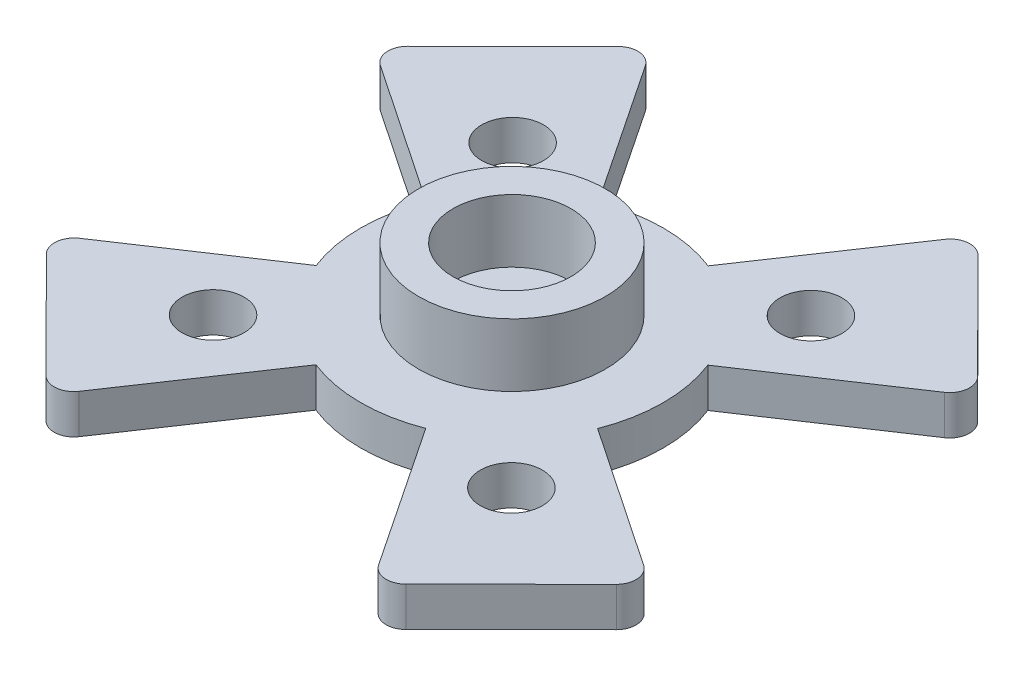
ISO-10303-21;
HEADER;
FILE_DESCRIPTION(('STEP AP214'),'2;1');
FILE_NAME('part.step','',(''),(''),'','','');
FILE_SCHEMA(('AUTOMOTIVE_DESIGN { 1 0 10303 214 1 1 1 1 }'));
ENDSEC;
DATA;
#1=APPLICATION_CONTEXT('core data for automotive mechanical design processes');
#2=APPLICATION_PROTOCOL_DEFINITION('international standard','automotive_design',2000,#1);
#3=PRODUCT_CONTEXT('',#1,'mechanical');
#4=PRODUCT('Part','Part','',(#3));
#5=PRODUCT_RELATED_PRODUCT_CATEGORY('part','',(#4));
#6=PRODUCT_DEFINITION_FORMATION('','',#4);
#7=PRODUCT_DEFINITION_CONTEXT('part definition',#1,'design');
#8=PRODUCT_DEFINITION('design','',#6,#7);
#9=PRODUCT_DEFINITION_SHAPE('','',#8);
#10=(LENGTH_UNIT() NAMED_UNIT(*) SI_UNIT(.MILLI.,.METRE.));
#11=(NAMED_UNIT(*) PLANE_ANGLE_UNIT() SI_UNIT($,.RADIAN.));
#12=(NAMED_UNIT(*) SI_UNIT($,.STERADIAN.) SOLID_ANGLE_UNIT());
#13=UNCERTAINTY_MEASURE_WITH_UNIT(LENGTH_MEASURE(1.E-05),#10,'distance_accuracy_value','');
#14=(GEOMETRIC_REPRESENTATION_CONTEXT(3) GLOBAL_UNCERTAINTY_ASSIGNED_CONTEXT((#13)) GLOBAL_UNIT_ASSIGNED_CONTEXT((#10,
#11,#12)) REPRESENTATION_CONTEXT('',''));
#15=CARTESIAN_POINT('',(0.,0.,0.));
#16=DIRECTION('',(0.,0.,1.));
#17=DIRECTION('',(1.,0.,0.));
#18=AXIS2_PLACEMENT_3D('',#15,#16,#17);
#19=CARTESIAN_POINT('',(0.,2.,0.));
#20=DIRECTION('',(0.,-1.,0.));
#21=DIRECTION('',(0.,0.,-1.));
#22=AXIS2_PLACEMENT_3D('',#19,#20,#21);
#23=CYLINDRICAL_SURFACE('',#22,7.69439913854554);
#24=CARTESIAN_POINT('',(0.,0.,0.));
#25=DIRECTION('',(0.,1.,0.));
#26=DIRECTION('',(0.,0.,1.));
#27=AXIS2_PLACEMENT_3D('',#24,#25,#26);
#28=CIRCLE('',#27,7.69439913854554);
#29=CARTESIAN_POINT('',(-2.80873592660673,0.,7.16343357600523));
#30=VERTEX_POINT('',#29);
#31=CARTESIAN_POINT('',(2.78582338133103,0.,7.17237521266699));
#32=VERTEX_POINT('',#31);
#33=EDGE_CURVE('E280',#30,#32,#28,.T.);
#34=ORIENTED_EDGE('',*,*,#33,.T.);
#35=DIRECTION('',(0.,-1.,0.));
#36=VECTOR('',#35,1.);
#37=CARTESIAN_POINT('',(2.78582338133103,2.,7.17237521266699));
#38=LINE('',#37,#36);
#39=CARTESIAN_POINT('',(2.78582338133103,2.,7.17237521266699));
#40=VERTEX_POINT('',#39);
#41=EDGE_CURVE('E261',#40,#32,#38,.T.);
#42=ORIENTED_EDGE('',*,*,#41,.F.);
#43=CARTESIAN_POINT('',(0.,2.,0.));
#44=DIRECTION('',(0.,1.,0.));
#45=DIRECTION('',(0.,0.,1.));
#46=AXIS2_PLACEMENT_3D('',#43,#44,#45);
#47=CIRCLE('',#46,7.69439913854554);
#48=CARTESIAN_POINT('',(-2.80873592660673,2.,7.16343357600523));
#49=VERTEX_POINT('',#48);
#50=EDGE_CURVE('E268',#49,#40,#47,.T.);
#51=ORIENTED_EDGE('',*,*,#50,.F.);
#52=DIRECTION('',(0.,-1.,0.));
#53=VECTOR('',#52,1.);
#54=CARTESIAN_POINT('',(-2.80873592660673,2.,7.16343357600523));
#55=LINE('',#54,#53);
#56=EDGE_CURVE('E441',#49,#30,#55,.T.);
#57=ORIENTED_EDGE('',*,*,#56,.T.);
#58=EDGE_LOOP('',(#34,#42,#51,#57));
#59=FACE_BOUND('',#58,.T.);
#60=ADVANCED_FACE('F92',(#59),#23,.T.);
#61=CARTESIAN_POINT('',(-1.38542538001352,2.,0.925024768868775));
#62=DIRECTION('',(-0.831660032932372,0.,0.555285142627574));
#63=DIRECTION('',(0.555285142627574,0.,0.831660032932373));
#64=AXIS2_PLACEMENT_3D('',#61,#62,#63);
#65=PLANE('',#64);
#66=DIRECTION('',(-0.555285142627574,0.,-0.831660032932373));
#67=VECTOR('',#66,1.);
#68=CARTESIAN_POINT('',(-1.38542538001352,0.,0.925024768868775));
#69=LINE('',#68,#67);
#70=CARTESIAN_POINT('',(7.60180761130886,0.,14.3853569689454));
#71=VERTEX_POINT('',#70);
#72=EDGE_CURVE('E613',#71,#32,#69,.T.);
#73=ORIENTED_EDGE('',*,*,#72,.F.);
#74=DIRECTION('',(0.,-1.,0.));
#75=VECTOR('',#74,1.);
#76=CARTESIAN_POINT('',(7.60180761130886,2.,14.3853569689454));
#77=LINE('',#76,#75);
#78=CARTESIAN_POINT('',(7.60180761130886,2.,14.3853569689454));
#79=VERTEX_POINT('',#78);
#80=EDGE_CURVE('E264',#71,#79,#77,.F.);
#81=ORIENTED_EDGE('',*,*,#80,.T.);
#82=DIRECTION('',(-0.555285142627574,0.,-0.831660032932373));
#83=VECTOR('',#82,1.);
#84=CARTESIAN_POINT('',(-1.38542538001352,2.,0.925024768868775));
#85=LINE('',#84,#83);
#86=EDGE_CURVE('E256',#79,#40,#85,.T.);
#87=ORIENTED_EDGE('',*,*,#86,.T.);
#88=ORIENTED_EDGE('',*,*,#41,.T.);
#89=EDGE_LOOP('',(#73,#81,#87,#88));
#90=FACE_BOUND('',#89,.T.);
#91=ADVANCED_FACE('F259',(#90),#65,.T.);
#92=CARTESIAN_POINT('',(11.8212683903879,2.,11.8667648689992));
#93=DIRECTION('',(0.705747373113323,0.,0.708463580816716));
#94=DIRECTION('',(0.708463580816716,0.,-0.705747373113323));
#95=AXIS2_PLACEMENT_3D('',#92,#93,#94);
#96=PLANE('',#95);
#97=DIRECTION('',(-0.708463580816716,0.,0.705747373113323));
#98=VECTOR('',#97,1.);
#99=CARTESIAN_POINT('',(11.8212683903879,0.,11.8667648689992));
#100=LINE('',#99,#98);
#101=CARTESIAN_POINT('',(14.5009215876691,0.,9.19738530448324));
#102=VERTEX_POINT('',#101);
#103=CARTESIAN_POINT('',(9.13921501735455,0.,14.5385354071345));
#104=VERTEX_POINT('',#103);
#105=EDGE_CURVE('E483',#102,#104,#100,.T.);
#106=ORIENTED_EDGE('',*,*,#105,.F.);
#107=DIRECTION('',(0.,-1.,0.));
#108=VECTOR('',#107,1.);
#109=CARTESIAN_POINT('',(14.5009215876691,2.,9.19738530448324));
#110=LINE('',#109,#108);
#111=CARTESIAN_POINT('',(14.5009215876691,2.,9.19738530448324));
#112=VERTEX_POINT('',#111);
#113=EDGE_CURVE('E372',#102,#112,#110,.F.);
#114=ORIENTED_EDGE('',*,*,#113,.T.);
#115=DIRECTION('',(-0.708463580816716,0.,0.705747373113323));
#116=VECTOR('',#115,1.);
#117=CARTESIAN_POINT('',(11.8212683903879,2.,11.8667648689992));
#118=LINE('',#117,#116);
#119=CARTESIAN_POINT('',(9.13921501735455,2.,14.5385354071345));
#120=VERTEX_POINT('',#119);
#121=EDGE_CURVE('E267',#112,#120,#118,.T.);
#122=ORIENTED_EDGE('',*,*,#121,.T.);
#123=DIRECTION('',(0.,-1.,0.));
#124=VECTOR('',#123,1.);
#125=CARTESIAN_POINT('',(9.13921501735455,2.,14.5385354071345));
#126=LINE('',#125,#124);
#127=EDGE_CURVE('E368',#120,#104,#126,.T.);
#128=ORIENTED_EDGE('',*,*,#127,.T.);
#129=EDGE_LOOP('',(#106,#114,#122,#128));
#130=FACE_BOUND('',#129,.T.);
#131=ADVANCED_FACE('F621',(#130),#96,.T.);
#132=CARTESIAN_POINT('',(0.938303404335213,2.,-1.39086193938097));
#133=DIRECTION('',(0.559256471974237,0.,-0.828994691511911));
#134=DIRECTION('',(-0.828994691511911,0.,-0.559256471974237));
#135=AXIS2_PLACEMENT_3D('',#132,#133,#134);
#136=PLANE('',#135);
#137=DIRECTION('',(0.828994691511911,0.,0.559256471974237));
#138=VECTOR('',#137,1.);
#139=CARTESIAN_POINT('',(0.938303404335213,2.,-1.39086193938097));
#140=LINE('',#139,#138);
#141=CARTESIAN_POINT('',(7.16343357600523,2.,2.80873592660673));
#142=VERTEX_POINT('',#141);
#143=CARTESIAN_POINT('',(14.35443068653,2.,7.65992703215462));
#144=VERTEX_POINT('',#143);
#145=EDGE_CURVE('E571',#142,#144,#140,.T.);
#146=ORIENTED_EDGE('',*,*,#145,.T.);
#147=DIRECTION('',(0.,-1.,0.));
#148=VECTOR('',#147,1.);
#149=CARTESIAN_POINT('',(14.35443068653,2.,7.65992703215462));
#150=LINE('',#149,#148);
#151=CARTESIAN_POINT('',(14.35443068653,0.,7.65992703215462));
#152=VERTEX_POINT('',#151);
#153=EDGE_CURVE('E364',#144,#152,#150,.T.);
#154=ORIENTED_EDGE('',*,*,#153,.T.);
#155=DIRECTION('',(0.828994691511911,0.,0.559256471974237));
#156=VECTOR('',#155,1.);
#157=CARTESIAN_POINT('',(0.938303404335213,0.,-1.39086193938097));
#158=LINE('',#157,#156);
#159=CARTESIAN_POINT('',(7.16343357600523,0.,2.80873592660673));
#160=VERTEX_POINT('',#159);
#161=EDGE_CURVE('E477',#160,#152,#158,.T.);
#162=ORIENTED_EDGE('',*,*,#161,.F.);
#163=DIRECTION('',(0.,-1.,0.));
#164=VECTOR('',#163,1.);
#165=CARTESIAN_POINT('',(7.16343357600523,2.,2.80873592660673));
#166=LINE('',#165,#164);
#167=EDGE_CURVE('E283',#142,#160,#166,.T.);
#168=ORIENTED_EDGE('',*,*,#167,.F.);
#169=EDGE_LOOP('',(#146,#154,#162,#168));
#170=FACE_BOUND('',#169,.T.);
#171=ADVANCED_FACE('F631',(#170),#136,.T.);
#172=CARTESIAN_POINT('',(0.,2.,0.));
#173=DIRECTION('',(0.,-1.,0.));
#174=DIRECTION('',(0.,0.,-1.));
#175=AXIS2_PLACEMENT_3D('',#172,#173,#174);
#176=CYLINDRICAL_SURFACE('',#175,7.69439913854554);
#177=CARTESIAN_POINT('',(0.,0.,0.));
#178=DIRECTION('',(0.,1.,0.));
#179=DIRECTION('',(0.,0.,1.));
#180=AXIS2_PLACEMENT_3D('',#177,#178,#179);
#181=CIRCLE('',#180,7.69439913854554);
#182=CARTESIAN_POINT('',(7.17237521266698,0.,-2.78582338133103));
#183=VERTEX_POINT('',#182);
#184=EDGE_CURVE('E472',#160,#183,#181,.T.);
#185=ORIENTED_EDGE('',*,*,#184,.T.);
#186=DIRECTION('',(0.,-1.,0.));
#187=VECTOR('',#186,1.);
#188=CARTESIAN_POINT('',(7.17237521266698,2.,-2.78582338133103));
#189=LINE('',#188,#187);
#190=CARTESIAN_POINT('',(7.17237521266698,2.,-2.78582338133103));
#191=VERTEX_POINT('',#190);
#192=EDGE_CURVE('E290',#191,#183,#189,.T.);
#193=ORIENTED_EDGE('',*,*,#192,.F.);
#194=CARTESIAN_POINT('',(0.,2.,0.));
#195=DIRECTION('',(0.,1.,0.));
#196=DIRECTION('',(0.,0.,1.));
#197=AXIS2_PLACEMENT_3D('',#194,#195,#196);
#198=CIRCLE('',#197,7.69439913854554);
#199=EDGE_CURVE('E565',#142,#191,#198,.T.);
#200=ORIENTED_EDGE('',*,*,#199,.F.);
#201=ORIENTED_EDGE('',*,*,#167,.T.);
#202=EDGE_LOOP('',(#185,#193,#200,#201));
#203=FACE_BOUND('',#202,.T.);
#204=ADVANCED_FACE('F473',(#203),#176,.T.);
#205=CARTESIAN_POINT('',(0.925024768868775,2.,1.38542538001352));
#206=DIRECTION('',(0.555285142627574,0.,0.831660032932373));
#207=DIRECTION('',(0.831660032932373,0.,-0.555285142627574));
#208=AXIS2_PLACEMENT_3D('',#205,#206,#207);
#209=PLANE('',#208);
#210=DIRECTION('',(-0.831660032932373,0.,0.555285142627574));
#211=VECTOR('',#210,1.);
#212=CARTESIAN_POINT('',(0.925024768868775,0.,1.38542538001352));
#213=LINE('',#212,#211);
#214=CARTESIAN_POINT('',(14.3853569689454,0.,-7.60180761130886));
#215=VERTEX_POINT('',#214);
#216=EDGE_CURVE('E464',#215,#183,#213,.T.);
#217=ORIENTED_EDGE('',*,*,#216,.F.);
#218=DIRECTION('',(0.,-1.,0.));
#219=VECTOR('',#218,1.);
#220=CARTESIAN_POINT('',(14.3853569689454,2.,-7.60180761130886));
#221=LINE('',#220,#219);
#222=CARTESIAN_POINT('',(14.3853569689454,2.,-7.60180761130886));
#223=VERTEX_POINT('',#222);
#224=EDGE_CURVE('E375',#215,#223,#221,.F.);
#225=ORIENTED_EDGE('',*,*,#224,.T.);
#226=DIRECTION('',(-0.831660032932373,0.,0.555285142627574));
#227=VECTOR('',#226,1.);
#228=CARTESIAN_POINT('',(0.925024768868775,2.,1.38542538001352));
#229=LINE('',#228,#227);
#230=EDGE_CURVE('E467',#223,#191,#229,.T.);
#231=ORIENTED_EDGE('',*,*,#230,.T.);
#232=ORIENTED_EDGE('',*,*,#192,.T.);
#233=EDGE_LOOP('',(#217,#225,#231,#232));
#234=FACE_BOUND('',#233,.T.);
#235=ADVANCED_FACE('F463',(#234),#209,.T.);
#236=CARTESIAN_POINT('',(11.8667648689992,2.,-11.8212683903878));
#237=DIRECTION('',(0.708463580816717,0.,-0.705747373113323));
#238=DIRECTION('',(-0.705747373113323,0.,-0.708463580816717));
#239=AXIS2_PLACEMENT_3D('',#236,#237,#238);
#240=PLANE('',#239);
#241=DIRECTION('',(0.705747373113323,0.,0.708463580816717));
#242=VECTOR('',#241,1.);
#243=CARTESIAN_POINT('',(11.8667648689992,0.,-11.8212683903878));
#244=LINE('',#243,#242);
#245=CARTESIAN_POINT('',(9.19738530448325,0.,-14.5009215876691));
#246=VERTEX_POINT('',#245);
#247=CARTESIAN_POINT('',(14.5385354071345,0.,-9.13921501735455));
#248=VERTEX_POINT('',#247);
#249=EDGE_CURVE('E481',#246,#248,#244,.T.);
#250=ORIENTED_EDGE('',*,*,#249,.F.);
#251=DIRECTION('',(0.,-1.,0.));
#252=VECTOR('',#251,1.);
#253=CARTESIAN_POINT('',(9.19738530448325,2.,-14.5009215876691));
#254=LINE('',#253,#252);
#255=CARTESIAN_POINT('',(9.19738530448325,2.,-14.5009215876691));
#256=VERTEX_POINT('',#255);
#257=EDGE_CURVE('E361',#246,#256,#254,.F.);
#258=ORIENTED_EDGE('',*,*,#257,.T.);
#259=DIRECTION('',(0.705747373113323,0.,0.708463580816717));
#260=VECTOR('',#259,1.);
#261=CARTESIAN_POINT('',(11.8667648689992,2.,-11.8212683903878));
#262=LINE('',#261,#260);
#263=CARTESIAN_POINT('',(14.5385354071345,2.,-9.13921501735455));
#264=VERTEX_POINT('',#263);
#265=EDGE_CURVE('E560',#256,#264,#262,.T.);
#266=ORIENTED_EDGE('',*,*,#265,.T.);
#267=DIRECTION('',(0.,-1.,0.));
#268=VECTOR('',#267,1.);
#269=CARTESIAN_POINT('',(14.5385354071345,2.,-9.13921501735455));
#270=LINE('',#269,#268);
#271=EDGE_CURVE('E357',#264,#248,#270,.T.);
#272=ORIENTED_EDGE('',*,*,#271,.T.);
#273=EDGE_LOOP('',(#250,#258,#266,#272));
#274=FACE_BOUND('',#273,.T.);
#275=ADVANCED_FACE('F556',(#274),#240,.T.);
#276=CARTESIAN_POINT('',(-1.39086193938097,2.,-0.938303404335213));
#277=DIRECTION('',(-0.828994691511911,0.,-0.559256471974237));
#278=DIRECTION('',(-0.559256471974237,0.,0.828994691511911));
#279=AXIS2_PLACEMENT_3D('',#276,#277,#278);
#280=PLANE('',#279);
#281=DIRECTION('',(0.559256471974237,0.,-0.828994691511911));
#282=VECTOR('',#281,1.);
#283=CARTESIAN_POINT('',(-1.39086193938097,2.,-0.938303404335213));
#284=LINE('',#283,#282);
#285=CARTESIAN_POINT('',(2.80873592660673,2.,-7.16343357600523));
#286=VERTEX_POINT('',#285);
#287=CARTESIAN_POINT('',(7.65992703215462,2.,-14.35443068653));
#288=VERTEX_POINT('',#287);
#289=EDGE_CURVE('E549',#286,#288,#284,.T.);
#290=ORIENTED_EDGE('',*,*,#289,.T.);
#291=DIRECTION('',(0.,-1.,0.));
#292=VECTOR('',#291,1.);
#293=CARTESIAN_POINT('',(7.65992703215462,2.,-14.35443068653));
#294=LINE('',#293,#292);
#295=CARTESIAN_POINT('',(7.65992703215462,0.,-14.35443068653));
#296=VERTEX_POINT('',#295);
#297=EDGE_CURVE('E353',#288,#296,#294,.T.);
#298=ORIENTED_EDGE('',*,*,#297,.T.);
#299=DIRECTION('',(0.559256471974237,0.,-0.828994691511911));
#300=VECTOR('',#299,1.);
#301=CARTESIAN_POINT('',(-1.39086193938097,0.,-0.938303404335213));
#302=LINE('',#301,#300);
#303=CARTESIAN_POINT('',(2.80873592660673,0.,-7.16343357600523));
#304=VERTEX_POINT('',#303);
#305=EDGE_CURVE('E490',#304,#296,#302,.T.);
#306=ORIENTED_EDGE('',*,*,#305,.F.);
#307=DIRECTION('',(0.,-1.,0.));
#308=VECTOR('',#307,1.);
#309=CARTESIAN_POINT('',(2.80873592660673,2.,-7.16343357600523));
#310=LINE('',#309,#308);
#311=EDGE_CURVE('E455',#286,#304,#310,.T.);
#312=ORIENTED_EDGE('',*,*,#311,.F.);
#313=EDGE_LOOP('',(#290,#298,#306,#312));
#314=FACE_BOUND('',#313,.T.);
#315=ADVANCED_FACE('F546',(#314),#280,.T.);
#316=CARTESIAN_POINT('',(0.,2.,0.));
#317=DIRECTION('',(0.,-1.,0.));
#318=DIRECTION('',(0.,0.,-1.));
#319=AXIS2_PLACEMENT_3D('',#316,#317,#318);
#320=CYLINDRICAL_SURFACE('',#319,7.69439913854554);
#321=CARTESIAN_POINT('',(0.,0.,0.));
#322=DIRECTION('',(0.,1.,0.));
#323=DIRECTION('',(0.,0.,1.));
#324=AXIS2_PLACEMENT_3D('',#321,#322,#323);
#325=CIRCLE('',#324,7.69439913854554);
#326=CARTESIAN_POINT('',(-2.78582338133103,0.,-7.17237521266698));
#327=VERTEX_POINT('',#326);
#328=EDGE_CURVE('E494',#304,#327,#325,.T.);
#329=ORIENTED_EDGE('',*,*,#328,.T.);
#330=DIRECTION('',(0.,-1.,0.));
#331=VECTOR('',#330,1.);
#332=CARTESIAN_POINT('',(-2.78582338133103,2.,-7.17237521266698));
#333=LINE('',#332,#331);
#334=CARTESIAN_POINT('',(-2.78582338133103,2.,-7.17237521266698));
#335=VERTEX_POINT('',#334);
#336=EDGE_CURVE('E451',#335,#327,#333,.T.);
#337=ORIENTED_EDGE('',*,*,#336,.F.);
#338=CARTESIAN_POINT('',(0.,2.,0.));
#339=DIRECTION('',(0.,1.,0.));
#340=DIRECTION('',(0.,0.,1.));
#341=AXIS2_PLACEMENT_3D('',#338,#339,#340);
#342=CIRCLE('',#341,7.69439913854554);
#343=EDGE_CURVE('E577',#286,#335,#342,.T.);
#344=ORIENTED_EDGE('',*,*,#343,.F.);
#345=ORIENTED_EDGE('',*,*,#311,.T.);
#346=EDGE_LOOP('',(#329,#337,#344,#345));
#347=FACE_BOUND('',#346,.T.);
#348=ADVANCED_FACE('F542',(#347),#320,.T.);
#349=CARTESIAN_POINT('',(1.38542538001352,2.,-0.925024768868777));
#350=DIRECTION('',(0.831660032932372,0.,-0.555285142627574));
#351=DIRECTION('',(-0.555285142627574,0.,-0.831660032932372));
#352=AXIS2_PLACEMENT_3D('',#349,#350,#351);
#353=PLANE('',#352);
#354=DIRECTION('',(0.555285142627574,0.,0.831660032932372));
#355=VECTOR('',#354,1.);
#356=CARTESIAN_POINT('',(1.38542538001352,0.,-0.925024768868777));
#357=LINE('',#356,#355);
#358=CARTESIAN_POINT('',(-7.60180761130886,0.,-14.3853569689454));
#359=VERTEX_POINT('',#358);
#360=EDGE_CURVE('E498',#359,#327,#357,.T.);
#361=ORIENTED_EDGE('',*,*,#360,.F.);
#362=DIRECTION('',(0.,-1.,0.));
#363=VECTOR('',#362,1.);
#364=CARTESIAN_POINT('',(-7.60180761130886,2.,-14.3853569689454));
#365=LINE('',#364,#363);
#366=CARTESIAN_POINT('',(-7.60180761130886,2.,-14.3853569689454));
#367=VERTEX_POINT('',#366);
#368=EDGE_CURVE('E350',#359,#367,#365,.F.);
#369=ORIENTED_EDGE('',*,*,#368,.T.);
#370=DIRECTION('',(0.555285142627574,0.,0.831660032932372));
#371=VECTOR('',#370,1.);
#372=CARTESIAN_POINT('',(1.38542538001352,2.,-0.925024768868777));
#373=LINE('',#372,#371);
#374=EDGE_CURVE('E538',#367,#335,#373,.T.);
#375=ORIENTED_EDGE('',*,*,#374,.T.);
#376=ORIENTED_EDGE('',*,*,#336,.T.);
#377=EDGE_LOOP('',(#361,#369,#375,#376));
#378=FACE_BOUND('',#377,.T.);
#379=ADVANCED_FACE('F535',(#378),#353,.T.);
#380=CARTESIAN_POINT('',(-11.8212683903879,2.,-11.8667648689992));
#381=DIRECTION('',(-0.705747373113323,0.,-0.708463580816716));
#382=DIRECTION('',(-0.708463580816716,0.,0.705747373113323));
#383=AXIS2_PLACEMENT_3D('',#380,#381,#382);
#384=PLANE('',#383);
#385=DIRECTION('',(0.708463580816716,0.,-0.705747373113323));
#386=VECTOR('',#385,1.);
#387=CARTESIAN_POINT('',(-11.8212683903879,0.,-11.8667648689992));
#388=LINE('',#387,#386);
#389=CARTESIAN_POINT('',(-14.5009215876691,0.,-9.19738530448324));
#390=VERTEX_POINT('',#389);
#391=CARTESIAN_POINT('',(-9.13921501735456,0.,-14.5385354071345));
#392=VERTEX_POINT('',#391);
#393=EDGE_CURVE('E501',#390,#392,#388,.T.);
#394=ORIENTED_EDGE('',*,*,#393,.F.);
#395=DIRECTION('',(0.,-1.,0.));
#396=VECTOR('',#395,1.);
#397=CARTESIAN_POINT('',(-14.5009215876691,2.,-9.19738530448324));
#398=LINE('',#397,#396);
#399=CARTESIAN_POINT('',(-14.5009215876691,2.,-9.19738530448324));
#400=VERTEX_POINT('',#399);
#401=EDGE_CURVE('E325',#390,#400,#398,.F.);
#402=ORIENTED_EDGE('',*,*,#401,.T.);
#403=DIRECTION('',(0.708463580816716,0.,-0.705747373113323));
#404=VECTOR('',#403,1.);
#405=CARTESIAN_POINT('',(-11.8212683903879,2.,-11.8667648689992));
#406=LINE('',#405,#404);
#407=CARTESIAN_POINT('',(-9.13921501735456,2.,-14.5385354071345));
#408=VERTEX_POINT('',#407);
#409=EDGE_CURVE('E527',#400,#408,#406,.T.);
#410=ORIENTED_EDGE('',*,*,#409,.T.);
#411=DIRECTION('',(0.,-1.,0.));
#412=VECTOR('',#411,1.);
#413=CARTESIAN_POINT('',(-9.13921501735456,2.,-14.5385354071345));
#414=LINE('',#413,#412);
#415=EDGE_CURVE('E321',#408,#392,#414,.T.);
#416=ORIENTED_EDGE('',*,*,#415,.T.);
#417=EDGE_LOOP('',(#394,#402,#410,#416));
#418=FACE_BOUND('',#417,.T.);
#419=ADVANCED_FACE('F524',(#418),#384,.T.);
#420=CARTESIAN_POINT('',(-0.938303404335212,2.,1.39086193938097));
#421=DIRECTION('',(-0.559256471974237,0.,0.828994691511911));
#422=DIRECTION('',(0.828994691511912,0.,0.559256471974237));
#423=AXIS2_PLACEMENT_3D('',#420,#421,#422);
#424=PLANE('',#423);
#425=DIRECTION('',(-0.828994691511912,0.,-0.559256471974237));
#426=VECTOR('',#425,1.);
#427=CARTESIAN_POINT('',(-0.938303404335212,2.,1.39086193938097));
#428=LINE('',#427,#426);
#429=CARTESIAN_POINT('',(-7.16343357600523,2.,-2.80873592660673));
#430=VERTEX_POINT('',#429);
#431=CARTESIAN_POINT('',(-14.35443068653,2.,-7.65992703215462));
#432=VERTEX_POINT('',#431);
#433=EDGE_CURVE('E517',#430,#432,#428,.T.);
#434=ORIENTED_EDGE('',*,*,#433,.T.);
#435=DIRECTION('',(0.,-1.,0.));
#436=VECTOR('',#435,1.);
#437=CARTESIAN_POINT('',(-14.35443068653,2.,-7.65992703215461));
#438=LINE('',#437,#436);
#439=CARTESIAN_POINT('',(-14.35443068653,0.,-7.65992703215462));
#440=VERTEX_POINT('',#439);
#441=EDGE_CURVE('E288',#432,#440,#438,.T.);
#442=ORIENTED_EDGE('',*,*,#441,.T.);
#443=DIRECTION('',(-0.828994691511912,0.,-0.559256471974237));
#444=VECTOR('',#443,1.);
#445=CARTESIAN_POINT('',(-0.938303404335212,0.,1.39086193938097));
#446=LINE('',#445,#444);
#447=CARTESIAN_POINT('',(-7.16343357600523,0.,-2.80873592660673));
#448=VERTEX_POINT('',#447);
#449=EDGE_CURVE('E505',#448,#440,#446,.T.);
#450=ORIENTED_EDGE('',*,*,#449,.F.);
#451=DIRECTION('',(0.,-1.,0.));
#452=VECTOR('',#451,1.);
#453=CARTESIAN_POINT('',(-7.16343357600523,2.,-2.80873592660673));
#454=LINE('',#453,#452);
#455=EDGE_CURVE('E448',#430,#448,#454,.T.);
#456=ORIENTED_EDGE('',*,*,#455,.F.);
#457=EDGE_LOOP('',(#434,#442,#450,#456));
#458=FACE_BOUND('',#457,.T.);
#459=ADVANCED_FACE('F515',(#458),#424,.T.);
#460=CARTESIAN_POINT('',(0.,2.,0.));
#461=DIRECTION('',(0.,-1.,0.));
#462=DIRECTION('',(0.,0.,-1.));
#463=AXIS2_PLACEMENT_3D('',#460,#461,#462);
#464=CYLINDRICAL_SURFACE('',#463,7.69439913854554);
#465=CARTESIAN_POINT('',(0.,0.,0.));
#466=DIRECTION('',(0.,1.,0.));
#467=DIRECTION('',(0.,0.,1.));
#468=AXIS2_PLACEMENT_3D('',#465,#466,#467);
#469=CIRCLE('',#468,7.69439913854554);
#470=CARTESIAN_POINT('',(-7.17237521266698,0.,2.78582338133103));
#471=VERTEX_POINT('',#470);
#472=EDGE_CURVE('E423',#448,#471,#469,.T.);
#473=ORIENTED_EDGE('',*,*,#472,.T.);
#474=DIRECTION('',(0.,-1.,0.));
#475=VECTOR('',#474,1.);
#476=CARTESIAN_POINT('',(-7.17237521266698,2.,2.78582338133103));
#477=LINE('',#476,#475);
#478=CARTESIAN_POINT('',(-7.17237521266698,2.,2.78582338133103));
#479=VERTEX_POINT('',#478);
#480=EDGE_CURVE('E444',#479,#471,#477,.T.);
#481=ORIENTED_EDGE('',*,*,#480,.F.);
#482=CARTESIAN_POINT('',(0.,2.,0.));
#483=DIRECTION('',(0.,1.,0.));
#484=DIRECTION('',(0.,0.,1.));
#485=AXIS2_PLACEMENT_3D('',#482,#483,#484);
#486=CIRCLE('',#485,7.69439913854554);
#487=EDGE_CURVE('E398',#430,#479,#486,.T.);
#488=ORIENTED_EDGE('',*,*,#487,.F.);
#489=ORIENTED_EDGE('',*,*,#455,.T.);
#490=EDGE_LOOP('',(#473,#481,#488,#489));
#491=FACE_BOUND('',#490,.T.);
#492=ADVANCED_FACE('F511',(#491),#464,.T.);
#493=CARTESIAN_POINT('',(-0.925024768868777,2.,-1.38542538001352));
#494=DIRECTION('',(-0.555285142627574,0.,-0.831660032932372));
#495=DIRECTION('',(-0.831660032932372,0.,0.555285142627574));
#496=AXIS2_PLACEMENT_3D('',#493,#494,#495);
#497=PLANE('',#496);
#498=DIRECTION('',(0.831660032932372,0.,-0.555285142627574));
#499=VECTOR('',#498,1.);
#500=CARTESIAN_POINT('',(-0.925024768868777,0.,-1.38542538001352));
#501=LINE('',#500,#499);
#502=CARTESIAN_POINT('',(-14.3853569689454,0.,7.60180761130886));
#503=VERTEX_POINT('',#502);
#504=EDGE_CURVE('E394',#503,#471,#501,.T.);
#505=ORIENTED_EDGE('',*,*,#504,.F.);
#506=DIRECTION('',(0.,-1.,0.));
#507=VECTOR('',#506,1.);
#508=CARTESIAN_POINT('',(-14.3853569689454,2.,7.60180761130886));
#509=LINE('',#508,#507);
#510=CARTESIAN_POINT('',(-14.3853569689454,2.,7.60180761130886));
#511=VERTEX_POINT('',#510);
#512=EDGE_CURVE('E101',#503,#511,#509,.F.);
#513=ORIENTED_EDGE('',*,*,#512,.T.);
#514=DIRECTION('',(0.831660032932372,0.,-0.555285142627574));
#515=VECTOR('',#514,1.);
#516=CARTESIAN_POINT('',(-0.925024768868777,2.,-1.38542538001352));
#517=LINE('',#516,#515);
#518=EDGE_CURVE('E392',#511,#479,#517,.T.);
#519=ORIENTED_EDGE('',*,*,#518,.T.);
#520=ORIENTED_EDGE('',*,*,#480,.T.);
#521=EDGE_LOOP('',(#505,#513,#519,#520));
#522=FACE_BOUND('',#521,.T.);
#523=ADVANCED_FACE('F390',(#522),#497,.T.);
#524=CARTESIAN_POINT('',(-11.8667648689992,2.,11.8212683903878));
#525=DIRECTION('',(-0.708463580816717,0.,0.705747373113323));
#526=DIRECTION('',(0.705747373113323,0.,0.708463580816717));
#527=AXIS2_PLACEMENT_3D('',#524,#525,#526);
#528=PLANE('',#527);
#529=DIRECTION('',(-0.705747373113323,0.,-0.708463580816717));
#530=VECTOR('',#529,1.);
#531=CARTESIAN_POINT('',(-11.8667648689992,2.,11.8212683903878));
#532=LINE('',#531,#530);
#533=CARTESIAN_POINT('',(-9.19738530448325,2.,14.5009215876691));
#534=VERTEX_POINT('',#533);
#535=CARTESIAN_POINT('',(-14.5385354071345,2.,9.13921501735456));
#536=VERTEX_POINT('',#535);
#537=EDGE_CURVE('E401',#534,#536,#532,.T.);
#538=ORIENTED_EDGE('',*,*,#537,.T.);
#539=DIRECTION('',(0.,-1.,0.));
#540=VECTOR('',#539,1.);
#541=CARTESIAN_POINT('',(-14.5385354071345,2.,9.13921501735456));
#542=LINE('',#541,#540);
#543=CARTESIAN_POINT('',(-14.5385354071345,0.,9.13921501735456));
#544=VERTEX_POINT('',#543);
#545=EDGE_CURVE('E383',#536,#544,#542,.T.);
#546=ORIENTED_EDGE('',*,*,#545,.T.);
#547=DIRECTION('',(-0.705747373113323,0.,-0.708463580816717));
#548=VECTOR('',#547,1.);
#549=CARTESIAN_POINT('',(-11.8667648689992,0.,11.8212683903878));
#550=LINE('',#549,#548);
#551=CARTESIAN_POINT('',(-9.19738530448325,0.,14.5009215876691));
#552=VERTEX_POINT('',#551);
#553=EDGE_CURVE('E409',#552,#544,#550,.T.);
#554=ORIENTED_EDGE('',*,*,#553,.F.);
#555=DIRECTION('',(0.,-1.,0.));
#556=VECTOR('',#555,1.);
#557=CARTESIAN_POINT('',(-9.19738530448325,2.,14.5009215876691));
#558=LINE('',#557,#556);
#559=EDGE_CURVE('E380',#552,#534,#558,.F.);
#560=ORIENTED_EDGE('',*,*,#559,.T.);
#561=EDGE_LOOP('',(#538,#546,#554,#560));
#562=FACE_BOUND('',#561,.T.);
#563=ADVANCED_FACE('F408',(#562),#528,.T.);
#564=CARTESIAN_POINT('',(-7.61701492973402,2.,7.58574871454421));
#565=DIRECTION('',(0.,-1.,0.));
#566=DIRECTION('',(0.,0.,-1.));
#567=AXIS2_PLACEMENT_3D('',#564,#565,#566);
#568=CYLINDRICAL_SURFACE('',#567,1.575);
#569=CARTESIAN_POINT('',(-7.61701492973402,2.,7.58574871454421));
#570=DIRECTION('',(0.,1.,0.));
#571=DIRECTION('',(0.,0.,1.));
#572=AXIS2_PLACEMENT_3D('',#569,#570,#571);
#573=CIRCLE('',#572,1.575);
#574=CARTESIAN_POINT('',(-7.61701492973402,2.,9.16074871454421));
#575=VERTEX_POINT('',#574);
#576=EDGE_CURVE('E604',#575,#575,#573,.T.);
#577=ORIENTED_EDGE('',*,*,#576,.T.);
#578=EDGE_LOOP('',(#577));
#579=FACE_BOUND('',#578,.T.);
#580=CARTESIAN_POINT('',(-7.61701492973402,0.,7.58574871454421));
#581=DIRECTION('',(0.,1.,0.));
#582=DIRECTION('',(0.,0.,1.));
#583=AXIS2_PLACEMENT_3D('',#580,#581,#582);
#584=CIRCLE('',#583,1.575);
#585=CARTESIAN_POINT('',(-7.61701492973402,0.,9.16074871454421));
#586=VERTEX_POINT('',#585);
#587=EDGE_CURVE('E434',#586,#586,#584,.T.);
#588=ORIENTED_EDGE('',*,*,#587,.F.);
#589=EDGE_LOOP('',(#588));
#590=FACE_BOUND('',#589,.T.);
#591=ADVANCED_FACE('F710',(#579,#590),#568,.F.);
#592=CARTESIAN_POINT('',(-7.58574871454421,2.,-7.61701492973401));
#593=DIRECTION('',(0.,-1.,0.));
#594=DIRECTION('',(0.,0.,-1.));
#595=AXIS2_PLACEMENT_3D('',#592,#593,#594);
#596=CYLINDRICAL_SURFACE('',#595,1.575);
#597=CARTESIAN_POINT('',(-7.58574871454421,2.,-7.61701492973401));
#598=DIRECTION('',(0.,1.,0.));
#599=DIRECTION('',(0.,0.,1.));
#600=AXIS2_PLACEMENT_3D('',#597,#598,#599);
#601=CIRCLE('',#600,1.575);
#602=CARTESIAN_POINT('',(-7.58574871454421,2.,-6.04201492973402));
#603=VERTEX_POINT('',#602);
#604=EDGE_CURVE('E600',#603,#603,#601,.T.);
#605=ORIENTED_EDGE('',*,*,#604,.T.);
#606=EDGE_LOOP('',(#605));
#607=FACE_BOUND('',#606,.T.);
#608=CARTESIAN_POINT('',(-7.58574871454421,0.,-7.61701492973401));
#609=DIRECTION('',(0.,1.,0.));
#610=DIRECTION('',(0.,0.,1.));
#611=AXIS2_PLACEMENT_3D('',#608,#609,#610);
#612=CIRCLE('',#611,1.575);
#613=CARTESIAN_POINT('',(-7.58574871454421,0.,-6.04201492973402));
#614=VERTEX_POINT('',#613);
#615=EDGE_CURVE('E430',#614,#614,#612,.T.);
#616=ORIENTED_EDGE('',*,*,#615,.F.);
#617=EDGE_LOOP('',(#616));
#618=FACE_BOUND('',#617,.T.);
#619=ADVANCED_FACE('F703',(#607,#618),#596,.F.);
#620=CARTESIAN_POINT('',(7.61701492973402,2.,-7.58574871454421));
#621=DIRECTION('',(0.,-1.,0.));
#622=DIRECTION('',(0.,0.,-1.));
#623=AXIS2_PLACEMENT_3D('',#620,#621,#622);
#624=CYLINDRICAL_SURFACE('',#623,1.575);
#625=CARTESIAN_POINT('',(7.61701492973402,2.,-7.58574871454421));
#626=DIRECTION('',(0.,1.,0.));
#627=DIRECTION('',(0.,0.,1.));
#628=AXIS2_PLACEMENT_3D('',#625,#626,#627);
#629=CIRCLE('',#628,1.575);
#630=CARTESIAN_POINT('',(7.61701492973402,2.,-6.01074871454421));
#631=VERTEX_POINT('',#630);
#632=EDGE_CURVE('E596',#631,#631,#629,.T.);
#633=ORIENTED_EDGE('',*,*,#632,.T.);
#634=EDGE_LOOP('',(#633));
#635=FACE_BOUND('',#634,.T.);
#636=CARTESIAN_POINT('',(7.61701492973402,0.,-7.58574871454421));
#637=DIRECTION('',(0.,1.,0.));
#638=DIRECTION('',(0.,0.,1.));
#639=AXIS2_PLACEMENT_3D('',#636,#637,#638);
#640=CIRCLE('',#639,1.575);
#641=CARTESIAN_POINT('',(7.61701492973402,0.,-6.01074871454421));
#642=VERTEX_POINT('',#641);
#643=EDGE_CURVE('E421',#642,#642,#640,.T.);
#644=ORIENTED_EDGE('',*,*,#643,.F.);
#645=EDGE_LOOP('',(#644));
#646=FACE_BOUND('',#645,.T.);
#647=ADVANCED_FACE('F695',(#635,#646),#624,.F.);
#648=CARTESIAN_POINT('',(1.39086193938097,2.,0.938303404335213));
#649=DIRECTION('',(0.828994691511911,0.,0.559256471974237));
#650=DIRECTION('',(0.559256471974237,0.,-0.828994691511911));
#651=AXIS2_PLACEMENT_3D('',#648,#649,#650);
#652=PLANE('',#651);
#653=DIRECTION('',(-0.559256471974237,0.,0.828994691511911));
#654=VECTOR('',#653,1.);
#655=CARTESIAN_POINT('',(1.39086193938097,2.,0.938303404335213));
#656=LINE('',#655,#654);
#657=CARTESIAN_POINT('',(-7.65992703215462,2.,14.35443068653));
#658=VERTEX_POINT('',#657);
#659=EDGE_CURVE('E274',#49,#658,#656,.T.);
#660=ORIENTED_EDGE('',*,*,#659,.T.);
#661=DIRECTION('',(0.,-1.,0.));
#662=VECTOR('',#661,1.);
#663=CARTESIAN_POINT('',(-7.65992703215462,2.,14.35443068653));
#664=LINE('',#663,#662);
#665=CARTESIAN_POINT('',(-7.65992703215462,0.,14.35443068653));
#666=VERTEX_POINT('',#665);
#667=EDGE_CURVE('E12',#658,#666,#664,.T.);
#668=ORIENTED_EDGE('',*,*,#667,.T.);
#669=DIRECTION('',(-0.559256471974237,0.,0.828994691511911));
#670=VECTOR('',#669,1.);
#671=CARTESIAN_POINT('',(1.39086193938097,0.,0.938303404335213));
#672=LINE('',#671,#670);
#673=EDGE_CURVE('E417',#30,#666,#672,.T.);
#674=ORIENTED_EDGE('',*,*,#673,.F.);
#675=ORIENTED_EDGE('',*,*,#56,.F.);
#676=EDGE_LOOP('',(#660,#668,#674,#675));
#677=FACE_BOUND('',#676,.T.);
#678=ADVANCED_FACE('F692',(#677),#652,.T.);
#679=CARTESIAN_POINT('',(7.58574871454421,2.,7.61701492973402));
#680=DIRECTION('',(0.,-1.,0.));
#681=DIRECTION('',(0.,0.,-1.));
#682=AXIS2_PLACEMENT_3D('',#679,#680,#681);
#683=CYLINDRICAL_SURFACE('',#682,1.57500000000003);
#684=CARTESIAN_POINT('',(7.58574871454421,2.,7.61701492973402));
#685=DIRECTION('',(0.,1.,0.));
#686=DIRECTION('',(0.,0.,1.));
#687=AXIS2_PLACEMENT_3D('',#684,#685,#686);
#688=CIRCLE('',#687,1.57500000000003);
#689=CARTESIAN_POINT('',(7.58574871454421,2.,9.19201492973404));
#690=VERTEX_POINT('',#689);
#691=EDGE_CURVE('E445',#690,#690,#688,.T.);
#692=ORIENTED_EDGE('',*,*,#691,.T.);
#693=EDGE_LOOP('',(#692));
#694=FACE_BOUND('',#693,.T.);
#695=CARTESIAN_POINT('',(7.58574871454421,0.,7.61701492973402));
#696=DIRECTION('',(0.,1.,0.));
#697=DIRECTION('',(0.,0.,1.));
#698=AXIS2_PLACEMENT_3D('',#695,#696,#697);
#699=CIRCLE('',#698,1.57500000000003);
#700=CARTESIAN_POINT('',(7.58574871454421,0.,9.19201492973404));
#701=VERTEX_POINT('',#700);
#702=EDGE_CURVE('E277',#701,#701,#699,.T.);
#703=ORIENTED_EDGE('',*,*,#702,.F.);
#704=EDGE_LOOP('',(#703));
#705=FACE_BOUND('',#704,.T.);
#706=ADVANCED_FACE('F694',(#694,#705),#683,.F.);
#707=CARTESIAN_POINT('',(0.,2.,0.));
#708=DIRECTION('',(0.,1.,0.));
#709=DIRECTION('',(0.,0.,1.));
#710=AXIS2_PLACEMENT_3D('',#707,#708,#709);
#711=PLANE('',#710);
#712=ORIENTED_EDGE('',*,*,#409,.F.);
#713=CARTESIAN_POINT('',(-13.7951742145557,2.,-8.48892172366652));
#714=DIRECTION('',(0.,1.,0.));
#715=DIRECTION('',(0.,0.,1.));
#716=AXIS2_PLACEMENT_3D('',#713,#714,#715);
#717=CIRCLE('',#716,1.);
#718=EDGE_CURVE('E347',#400,#432,#717,.T.);
#719=ORIENTED_EDGE('',*,*,#718,.T.);
#720=ORIENTED_EDGE('',*,*,#433,.F.);
#721=ORIENTED_EDGE('',*,*,#487,.T.);
#722=ORIENTED_EDGE('',*,*,#518,.F.);
#723=CARTESIAN_POINT('',(-13.8300718263178,2.,8.43346764424123));
#724=DIRECTION('',(0.,1.,0.));
#725=DIRECTION('',(0.,0.,1.));
#726=AXIS2_PLACEMENT_3D('',#723,#724,#725);
#727=CIRCLE('',#726,1.);
#728=EDGE_CURVE('E114',#511,#536,#727,.T.);
#729=ORIENTED_EDGE('',*,*,#728,.T.);
#730=ORIENTED_EDGE('',*,*,#537,.F.);
#731=CARTESIAN_POINT('',(-8.48892172366653,2.,13.7951742145557));
#732=DIRECTION('',(0.,1.,0.));
#733=DIRECTION('',(0.,0.,1.));
#734=AXIS2_PLACEMENT_3D('',#731,#732,#733);
#735=CIRCLE('',#734,1.);
#736=EDGE_CURVE('E108',#534,#658,#735,.T.);
#737=ORIENTED_EDGE('',*,*,#736,.T.);
#738=ORIENTED_EDGE('',*,*,#659,.F.);
#739=ORIENTED_EDGE('',*,*,#50,.T.);
#740=ORIENTED_EDGE('',*,*,#86,.F.);
#741=CARTESIAN_POINT('',(8.43346764424123,2.,13.8300718263178));
#742=DIRECTION('',(0.,1.,0.));
#743=DIRECTION('',(0.,0.,1.));
#744=AXIS2_PLACEMENT_3D('',#741,#742,#743);
#745=CIRCLE('',#744,1.);
#746=EDGE_CURVE('E332',#79,#120,#745,.T.);
#747=ORIENTED_EDGE('',*,*,#746,.T.);
#748=ORIENTED_EDGE('',*,*,#121,.F.);
#749=CARTESIAN_POINT('',(13.7951742145557,2.,8.48892172366653));
#750=DIRECTION('',(0.,1.,0.));
#751=DIRECTION('',(0.,0.,1.));
#752=AXIS2_PLACEMENT_3D('',#749,#750,#751);
#753=CIRCLE('',#752,1.);
#754=EDGE_CURVE('E338',#112,#144,#753,.T.);
#755=ORIENTED_EDGE('',*,*,#754,.T.);
#756=ORIENTED_EDGE('',*,*,#145,.F.);
#757=ORIENTED_EDGE('',*,*,#199,.T.);
#758=ORIENTED_EDGE('',*,*,#230,.F.);
#759=CARTESIAN_POINT('',(13.8300718263178,2.,-8.43346764424123));
#760=DIRECTION('',(0.,1.,0.));
#761=DIRECTION('',(0.,0.,1.));
#762=AXIS2_PLACEMENT_3D('',#759,#760,#761);
#763=CIRCLE('',#762,1.);
#764=EDGE_CURVE('E335',#223,#264,#763,.T.);
#765=ORIENTED_EDGE('',*,*,#764,.T.);
#766=ORIENTED_EDGE('',*,*,#265,.F.);
#767=CARTESIAN_POINT('',(8.48892172366653,2.,-13.7951742145557));
#768=DIRECTION('',(0.,1.,0.));
#769=DIRECTION('',(0.,0.,1.));
#770=AXIS2_PLACEMENT_3D('',#767,#768,#769);
#771=CIRCLE('',#770,1.);
#772=EDGE_CURVE('E341',#256,#288,#771,.T.);
#773=ORIENTED_EDGE('',*,*,#772,.T.);
#774=ORIENTED_EDGE('',*,*,#289,.F.);
#775=ORIENTED_EDGE('',*,*,#343,.T.);
#776=ORIENTED_EDGE('',*,*,#374,.F.);
#777=CARTESIAN_POINT('',(-8.43346764424123,2.,-13.8300718263178));
#778=DIRECTION('',(0.,1.,0.));
#779=DIRECTION('',(0.,0.,1.));
#780=AXIS2_PLACEMENT_3D('',#777,#778,#779);
#781=CIRCLE('',#780,1.);
#782=EDGE_CURVE('E344',#367,#408,#781,.T.);
#783=ORIENTED_EDGE('',*,*,#782,.T.);
#784=EDGE_LOOP('',(#712,#719,#720,#721,#722,#729,#730,#737,#738,#739,#740,#747,#748,#755,#756,
#757,#758,#765,#766,#773,#774,#775,#776,#783));
#785=FACE_BOUND('',#784,.T.);
#786=CARTESIAN_POINT('',(0.,2.,0.));
#787=DIRECTION('',(0.,1.,0.));
#788=DIRECTION('',(0.,0.,1.));
#789=AXIS2_PLACEMENT_3D('',#786,#787,#788);
#790=CIRCLE('',#789,4.75);
#791=CARTESIAN_POINT('',(0.,2.,4.75));
#792=VERTEX_POINT('',#791);
#793=EDGE_CURVE('E592',#792,#792,#790,.T.);
#794=ORIENTED_EDGE('',*,*,#793,.F.);
#795=EDGE_LOOP('',(#794));
#796=FACE_BOUND('',#795,.T.);
#797=ORIENTED_EDGE('',*,*,#632,.F.);
#798=EDGE_LOOP('',(#797));
#799=FACE_BOUND('',#798,.T.);
#800=ORIENTED_EDGE('',*,*,#604,.F.);
#801=EDGE_LOOP('',(#800));
#802=FACE_BOUND('',#801,.T.);
#803=ORIENTED_EDGE('',*,*,#576,.F.);
#804=EDGE_LOOP('',(#803));
#805=FACE_BOUND('',#804,.T.);
#806=ORIENTED_EDGE('',*,*,#691,.F.);
#807=EDGE_LOOP('',(#806));
#808=FACE_BOUND('',#807,.T.);
#809=ADVANCED_FACE('F272',(#785,#796,#799,#802,#805,#808),#711,.T.);
#810=CARTESIAN_POINT('',(0.,0.,0.));
#811=DIRECTION('',(0.,1.,0.));
#812=DIRECTION('',(0.,0.,1.));
#813=AXIS2_PLACEMENT_3D('',#810,#811,#812);
#814=PLANE('',#813);
#815=ORIENTED_EDGE('',*,*,#449,.T.);
#816=CARTESIAN_POINT('',(-13.7951742145557,0.,-8.48892172366652));
#817=DIRECTION('',(0.,1.,0.));
#818=DIRECTION('',(0.,0.,1.));
#819=AXIS2_PLACEMENT_3D('',#816,#817,#818);
#820=CIRCLE('',#819,1.);
#821=EDGE_CURVE('E318',#440,#390,#820,.F.);
#822=ORIENTED_EDGE('',*,*,#821,.T.);
#823=ORIENTED_EDGE('',*,*,#393,.T.);
#824=CARTESIAN_POINT('',(-8.43346764424123,0.,-13.8300718263178));
#825=DIRECTION('',(0.,1.,0.));
#826=DIRECTION('',(0.,0.,1.));
#827=AXIS2_PLACEMENT_3D('',#824,#825,#826);
#828=CIRCLE('',#827,1.);
#829=EDGE_CURVE('E315',#392,#359,#828,.F.);
#830=ORIENTED_EDGE('',*,*,#829,.T.);
#831=ORIENTED_EDGE('',*,*,#360,.T.);
#832=ORIENTED_EDGE('',*,*,#328,.F.);
#833=ORIENTED_EDGE('',*,*,#305,.T.);
#834=CARTESIAN_POINT('',(8.48892172366653,0.,-13.7951742145557));
#835=DIRECTION('',(0.,1.,0.));
#836=DIRECTION('',(0.,0.,1.));
#837=AXIS2_PLACEMENT_3D('',#834,#835,#836);
#838=CIRCLE('',#837,1.);
#839=EDGE_CURVE('E312',#296,#246,#838,.F.);
#840=ORIENTED_EDGE('',*,*,#839,.T.);
#841=ORIENTED_EDGE('',*,*,#249,.T.);
#842=CARTESIAN_POINT('',(13.8300718263178,0.,-8.43346764424123));
#843=DIRECTION('',(0.,1.,0.));
#844=DIRECTION('',(0.,0.,1.));
#845=AXIS2_PLACEMENT_3D('',#842,#843,#844);
#846=CIRCLE('',#845,1.);
#847=EDGE_CURVE('E306',#248,#215,#846,.F.);
#848=ORIENTED_EDGE('',*,*,#847,.T.);
#849=ORIENTED_EDGE('',*,*,#216,.T.);
#850=ORIENTED_EDGE('',*,*,#184,.F.);
#851=ORIENTED_EDGE('',*,*,#161,.T.);
#852=CARTESIAN_POINT('',(13.7951742145557,0.,8.48892172366653));
#853=DIRECTION('',(0.,1.,0.));
#854=DIRECTION('',(0.,0.,1.));
#855=AXIS2_PLACEMENT_3D('',#852,#853,#854);
#856=CIRCLE('',#855,1.);
#857=EDGE_CURVE('E309',#152,#102,#856,.F.);
#858=ORIENTED_EDGE('',*,*,#857,.T.);
#859=ORIENTED_EDGE('',*,*,#105,.T.);
#860=CARTESIAN_POINT('',(8.43346764424123,0.,13.8300718263178));
#861=DIRECTION('',(0.,1.,0.));
#862=DIRECTION('',(0.,0.,1.));
#863=AXIS2_PLACEMENT_3D('',#860,#861,#862);
#864=CIRCLE('',#863,1.);
#865=EDGE_CURVE('E303',#104,#71,#864,.F.);
#866=ORIENTED_EDGE('',*,*,#865,.T.);
#867=ORIENTED_EDGE('',*,*,#72,.T.);
#868=ORIENTED_EDGE('',*,*,#33,.F.);
#869=ORIENTED_EDGE('',*,*,#673,.T.);
#870=CARTESIAN_POINT('',(-8.48892172366653,0.,13.7951742145557));
#871=DIRECTION('',(0.,1.,0.));
#872=DIRECTION('',(0.,0.,1.));
#873=AXIS2_PLACEMENT_3D('',#870,#871,#872);
#874=CIRCLE('',#873,1.);
#875=EDGE_CURVE('E297',#666,#552,#874,.F.);
#876=ORIENTED_EDGE('',*,*,#875,.T.);
#877=ORIENTED_EDGE('',*,*,#553,.T.);
#878=CARTESIAN_POINT('',(-13.8300718263178,0.,8.43346764424123));
#879=DIRECTION('',(0.,1.,0.));
#880=DIRECTION('',(0.,0.,1.));
#881=AXIS2_PLACEMENT_3D('',#878,#879,#880);
#882=CIRCLE('',#881,1.);
#883=EDGE_CURVE('E300',#544,#503,#882,.F.);
#884=ORIENTED_EDGE('',*,*,#883,.T.);
#885=ORIENTED_EDGE('',*,*,#504,.T.);
#886=ORIENTED_EDGE('',*,*,#472,.F.);
#887=EDGE_LOOP('',(#815,#822,#823,#830,#831,#832,#833,#840,#841,#848,#849,#850,#851,#858,#859,
#866,#867,#868,#869,#876,#877,#884,#885,#886));
#888=FACE_BOUND('',#887,.T.);
#889=ORIENTED_EDGE('',*,*,#643,.T.);
#890=EDGE_LOOP('',(#889));
#891=FACE_BOUND('',#890,.T.);
#892=ORIENTED_EDGE('',*,*,#615,.T.);
#893=EDGE_LOOP('',(#892));
#894=FACE_BOUND('',#893,.T.);
#895=ORIENTED_EDGE('',*,*,#587,.T.);
#896=EDGE_LOOP('',(#895));
#897=FACE_BOUND('',#896,.T.);
#898=ORIENTED_EDGE('',*,*,#702,.T.);
#899=EDGE_LOOP('',(#898));
#900=FACE_BOUND('',#899,.T.);
#901=ADVANCED_FACE('F413',(#888,#891,#894,#897,#900),#814,.F.);
#902=CARTESIAN_POINT('',(0.,5.2,0.));
#903=DIRECTION('',(0.,-1.,0.));
#904=DIRECTION('',(0.,0.,-1.));
#905=AXIS2_PLACEMENT_3D('',#902,#903,#904);
#906=CYLINDRICAL_SURFACE('',#905,4.75);
#907=ORIENTED_EDGE('',*,*,#793,.T.);
#908=EDGE_LOOP('',(#907));
#909=FACE_BOUND('',#908,.T.);
#910=CARTESIAN_POINT('',(0.,5.2,0.));
#911=DIRECTION('',(0.,1.,0.));
#912=DIRECTION('',(0.,0.,1.));
#913=AXIS2_PLACEMENT_3D('',#910,#911,#912);
#914=CIRCLE('',#913,4.75);
#915=CARTESIAN_POINT('',(0.,5.2,4.75));
#916=VERTEX_POINT('',#915);
#917=EDGE_CURVE('E639',#916,#916,#914,.T.);
#918=ORIENTED_EDGE('',*,*,#917,.F.);
#919=EDGE_LOOP('',(#918));
#920=FACE_BOUND('',#919,.T.);
#921=ADVANCED_FACE('F647',(#909,#920),#906,.T.);
#922=CARTESIAN_POINT('',(0.,5.2,0.));
#923=DIRECTION('',(0.,-1.,0.));
#924=DIRECTION('',(0.,0.,-1.));
#925=AXIS2_PLACEMENT_3D('',#922,#923,#924);
#926=CYLINDRICAL_SURFACE('',#925,3.);
#927=CARTESIAN_POINT('',(0.,2.,0.));
#928=DIRECTION('',(0.,1.,0.));
#929=DIRECTION('',(0.,0.,1.));
#930=AXIS2_PLACEMENT_3D('',#927,#928,#929);
#931=CIRCLE('',#930,3.);
#932=CARTESIAN_POINT('',(0.,2.,3.));
#933=VERTEX_POINT('',#932);
#934=EDGE_CURVE('E282',#933,#933,#931,.T.);
#935=ORIENTED_EDGE('',*,*,#934,.F.);
#936=EDGE_LOOP('',(#935));
#937=FACE_BOUND('',#936,.T.);
#938=CARTESIAN_POINT('',(0.,5.2,0.));
#939=DIRECTION('',(0.,1.,0.));
#940=DIRECTION('',(0.,0.,1.));
#941=AXIS2_PLACEMENT_3D('',#938,#939,#940);
#942=CIRCLE('',#941,3.);
#943=CARTESIAN_POINT('',(0.,5.2,3.));
#944=VERTEX_POINT('',#943);
#945=EDGE_CURVE('E614',#944,#944,#942,.T.);
#946=ORIENTED_EDGE('',*,*,#945,.T.);
#947=EDGE_LOOP('',(#946));
#948=FACE_BOUND('',#947,.T.);
#949=ADVANCED_FACE('F649',(#937,#948),#926,.F.);
#950=CARTESIAN_POINT('',(0.,5.2,0.));
#951=DIRECTION('',(0.,1.,0.));
#952=DIRECTION('',(0.,0.,1.));
#953=AXIS2_PLACEMENT_3D('',#950,#951,#952);
#954=PLANE('',#953);
#955=ORIENTED_EDGE('',*,*,#917,.T.);
#956=EDGE_LOOP('',(#955));
#957=FACE_BOUND('',#956,.T.);
#958=ORIENTED_EDGE('',*,*,#945,.F.);
#959=EDGE_LOOP('',(#958));
#960=FACE_BOUND('',#959,.T.);
#961=ADVANCED_FACE('F644',(#957,#960),#954,.T.);
#962=CARTESIAN_POINT('',(0.,2.,0.));
#963=DIRECTION('',(0.,1.,0.));
#964=DIRECTION('',(0.,0.,1.));
#965=AXIS2_PLACEMENT_3D('',#962,#963,#964);
#966=PLANE('',#965);
#967=ORIENTED_EDGE('',*,*,#934,.T.);
#968=EDGE_LOOP('',(#967));
#969=FACE_BOUND('',#968,.T.);
#970=ADVANCED_FACE('F670',(#969),#966,.T.);
#971=CARTESIAN_POINT('',(-13.7951742145557,2.,-8.48892172366652));
#972=DIRECTION('',(0.,-1.,0.));
#973=DIRECTION('',(0.,0.,-1.));
#974=AXIS2_PLACEMENT_3D('',#971,#972,#973);
#975=CYLINDRICAL_SURFACE('',#974,1.);
#976=ORIENTED_EDGE('',*,*,#718,.F.);
#977=ORIENTED_EDGE('',*,*,#401,.F.);
#978=ORIENTED_EDGE('',*,*,#821,.F.);
#979=ORIENTED_EDGE('',*,*,#441,.F.);
#980=EDGE_LOOP('',(#976,#977,#978,#979));
#981=FACE_BOUND('',#980,.T.);
#982=ADVANCED_FACE('F520',(#981),#975,.T.);
#983=CARTESIAN_POINT('',(-8.43346764424123,2.,-13.8300718263178));
#984=DIRECTION('',(0.,-1.,0.));
#985=DIRECTION('',(0.,0.,-1.));
#986=AXIS2_PLACEMENT_3D('',#983,#984,#985);
#987=CYLINDRICAL_SURFACE('',#986,1.);
#988=ORIENTED_EDGE('',*,*,#782,.F.);
#989=ORIENTED_EDGE('',*,*,#368,.F.);
#990=ORIENTED_EDGE('',*,*,#829,.F.);
#991=ORIENTED_EDGE('',*,*,#415,.F.);
#992=EDGE_LOOP('',(#988,#989,#990,#991));
#993=FACE_BOUND('',#992,.T.);
#994=ADVANCED_FACE('F530',(#993),#987,.T.);
#995=CARTESIAN_POINT('',(8.48892172366653,2.,-13.7951742145557));
#996=DIRECTION('',(0.,-1.,0.));
#997=DIRECTION('',(0.,0.,-1.));
#998=AXIS2_PLACEMENT_3D('',#995,#996,#997);
#999=CYLINDRICAL_SURFACE('',#998,1.);
#1000=ORIENTED_EDGE('',*,*,#772,.F.);
#1001=ORIENTED_EDGE('',*,*,#257,.F.);
#1002=ORIENTED_EDGE('',*,*,#839,.F.);
#1003=ORIENTED_EDGE('',*,*,#297,.F.);
#1004=EDGE_LOOP('',(#1000,#1001,#1002,#1003));
#1005=FACE_BOUND('',#1004,.T.);
#1006=ADVANCED_FACE('F552',(#1005),#999,.T.);
#1007=CARTESIAN_POINT('',(13.7951742145557,2.,8.48892172366653));
#1008=DIRECTION('',(0.,-1.,0.));
#1009=DIRECTION('',(0.,0.,-1.));
#1010=AXIS2_PLACEMENT_3D('',#1007,#1008,#1009);
#1011=CYLINDRICAL_SURFACE('',#1010,1.);
#1012=ORIENTED_EDGE('',*,*,#754,.F.);
#1013=ORIENTED_EDGE('',*,*,#113,.F.);
#1014=ORIENTED_EDGE('',*,*,#857,.F.);
#1015=ORIENTED_EDGE('',*,*,#153,.F.);
#1016=EDGE_LOOP('',(#1012,#1013,#1014,#1015));
#1017=FACE_BOUND('',#1016,.T.);
#1018=ADVANCED_FACE('F627',(#1017),#1011,.T.);
#1019=CARTESIAN_POINT('',(13.8300718263178,2.,-8.43346764424123));
#1020=DIRECTION('',(0.,-1.,0.));
#1021=DIRECTION('',(0.,0.,-1.));
#1022=AXIS2_PLACEMENT_3D('',#1019,#1020,#1021);
#1023=CYLINDRICAL_SURFACE('',#1022,1.);
#1024=ORIENTED_EDGE('',*,*,#764,.F.);
#1025=ORIENTED_EDGE('',*,*,#224,.F.);
#1026=ORIENTED_EDGE('',*,*,#847,.F.);
#1027=ORIENTED_EDGE('',*,*,#271,.F.);
#1028=EDGE_LOOP('',(#1024,#1025,#1026,#1027));
#1029=FACE_BOUND('',#1028,.T.);
#1030=ADVANCED_FACE('F563',(#1029),#1023,.T.);
#1031=CARTESIAN_POINT('',(8.43346764424123,2.,13.8300718263178));
#1032=DIRECTION('',(0.,-1.,0.));
#1033=DIRECTION('',(0.,0.,-1.));
#1034=AXIS2_PLACEMENT_3D('',#1031,#1032,#1033);
#1035=CYLINDRICAL_SURFACE('',#1034,1.);
#1036=ORIENTED_EDGE('',*,*,#746,.F.);
#1037=ORIENTED_EDGE('',*,*,#80,.F.);
#1038=ORIENTED_EDGE('',*,*,#865,.F.);
#1039=ORIENTED_EDGE('',*,*,#127,.F.);
#1040=EDGE_LOOP('',(#1036,#1037,#1038,#1039));
#1041=FACE_BOUND('',#1040,.T.);
#1042=ADVANCED_FACE('F679',(#1041),#1035,.T.);
#1043=CARTESIAN_POINT('',(-13.8300718263178,2.,8.43346764424123));
#1044=DIRECTION('',(0.,-1.,0.));
#1045=DIRECTION('',(0.,0.,-1.));
#1046=AXIS2_PLACEMENT_3D('',#1043,#1044,#1045);
#1047=CYLINDRICAL_SURFACE('',#1046,1.);
#1048=ORIENTED_EDGE('',*,*,#728,.F.);
#1049=ORIENTED_EDGE('',*,*,#512,.F.);
#1050=ORIENTED_EDGE('',*,*,#883,.F.);
#1051=ORIENTED_EDGE('',*,*,#545,.F.);
#1052=EDGE_LOOP('',(#1048,#1049,#1050,#1051));
#1053=FACE_BOUND('',#1052,.T.);
#1054=ADVANCED_FACE('F404',(#1053),#1047,.T.);
#1055=CARTESIAN_POINT('',(-8.48892172366653,2.,13.7951742145557));
#1056=DIRECTION('',(0.,-1.,0.));
#1057=DIRECTION('',(0.,0.,-1.));
#1058=AXIS2_PLACEMENT_3D('',#1055,#1056,#1057);
#1059=CYLINDRICAL_SURFACE('',#1058,1.);
#1060=ORIENTED_EDGE('',*,*,#736,.F.);
#1061=ORIENTED_EDGE('',*,*,#559,.F.);
#1062=ORIENTED_EDGE('',*,*,#875,.F.);
#1063=ORIENTED_EDGE('',*,*,#667,.F.);
#1064=EDGE_LOOP('',(#1060,#1061,#1062,#1063));
#1065=FACE_BOUND('',#1064,.T.);
#1066=ADVANCED_FACE('F94',(#1065),#1059,.T.);
#1067=CLOSED_SHELL('',(#60,#91,#131,#171,#204,#235,#275,#315,#348,#379,#419,#459,#492,#523,#563,
#591,#619,#647,#678,#706,#809,#901,#921,#949,#961,#970,#982,#994,#1006,#1018,#1030,#1042,#1054,#1066));
#1068=MANIFOLD_SOLID_BREP('B2',#1067);
#1069=ADVANCED_BREP_SHAPE_REPRESENTATION('',(#18,#1068),#14);
#1070=SHAPE_DEFINITION_REPRESENTATION(#9,#1069);
ENDSEC;
END-ISO-10303-21;
